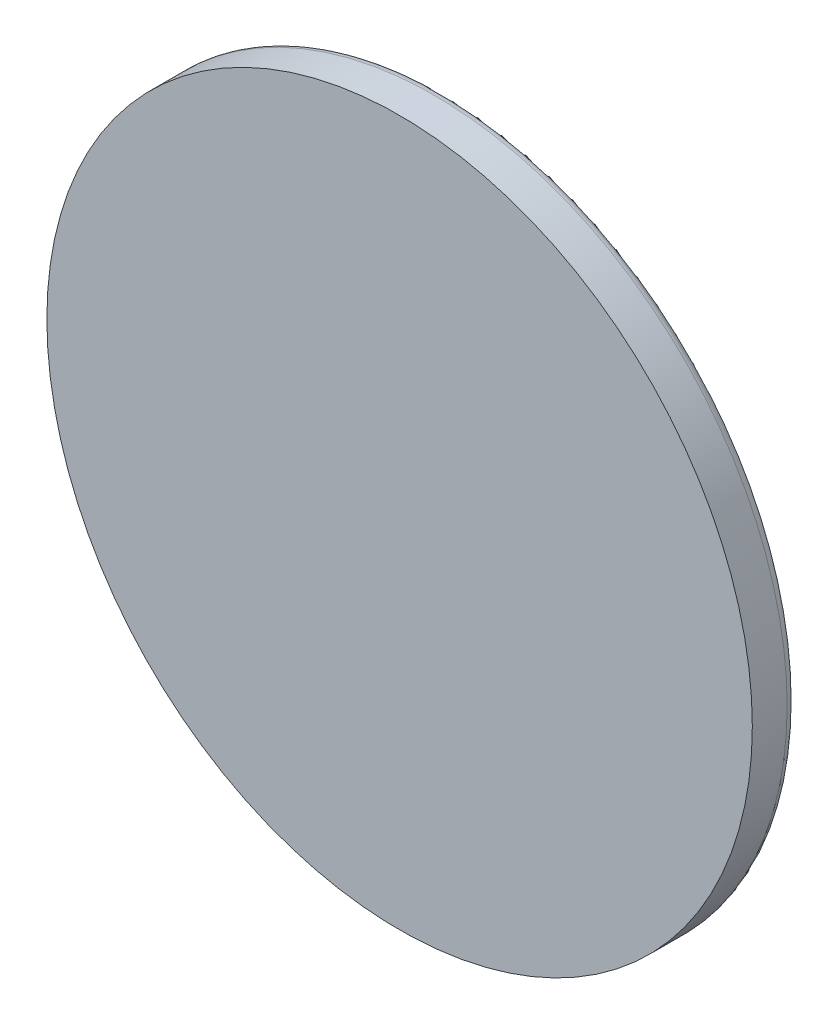
ISO-10303-21;
HEADER;
FILE_DESCRIPTION(('STEP AP214'),'2;1');
FILE_NAME('part.step','',(''),(''),'','','');
FILE_SCHEMA(('AUTOMOTIVE_DESIGN { 1 0 10303 214 1 1 1 1 }'));
ENDSEC;
DATA;
#1=APPLICATION_CONTEXT('core data for automotive mechanical design processes');
#2=APPLICATION_PROTOCOL_DEFINITION('international standard','automotive_design',2000,#1);
#3=PRODUCT_CONTEXT('',#1,'mechanical');
#4=PRODUCT('Part','Part','',(#3));
#5=PRODUCT_RELATED_PRODUCT_CATEGORY('part','',(#4));
#6=PRODUCT_DEFINITION_FORMATION('','',#4);
#7=PRODUCT_DEFINITION_CONTEXT('part definition',#1,'design');
#8=PRODUCT_DEFINITION('design','',#6,#7);
#9=PRODUCT_DEFINITION_SHAPE('','',#8);
#10=(LENGTH_UNIT() NAMED_UNIT(*) SI_UNIT(.MILLI.,.METRE.));
#11=(NAMED_UNIT(*) PLANE_ANGLE_UNIT() SI_UNIT($,.RADIAN.));
#12=(NAMED_UNIT(*) SI_UNIT($,.STERADIAN.) SOLID_ANGLE_UNIT());
#13=UNCERTAINTY_MEASURE_WITH_UNIT(LENGTH_MEASURE(1.E-05),#10,'distance_accuracy_value','');
#14=(GEOMETRIC_REPRESENTATION_CONTEXT(3) GLOBAL_UNCERTAINTY_ASSIGNED_CONTEXT((#13)) GLOBAL_UNIT_ASSIGNED_CONTEXT((#10,
#11,#12)) REPRESENTATION_CONTEXT('',''));
#15=CARTESIAN_POINT('',(0.,0.,0.));
#16=DIRECTION('',(0.,0.,1.));
#17=DIRECTION('',(1.,0.,0.));
#18=AXIS2_PLACEMENT_3D('',#15,#16,#17);
#19=CARTESIAN_POINT('',(-43.,22.86,-2.3495));
#20=DIRECTION('',(0.,0.,1.));
#21=DIRECTION('',(1.,0.,0.));
#22=AXIS2_PLACEMENT_3D('',#19,#20,#21);
#23=CYLINDRICAL_SURFACE('',#22,18.65);
#24=CARTESIAN_POINT('',(-43.,22.86,-1.8415));
#25=DIRECTION('',(0.,0.,1.));
#26=DIRECTION('',(1.,0.,0.));
#27=AXIS2_PLACEMENT_3D('',#24,#25,#26);
#28=CIRCLE('',#27,18.65);
#29=CARTESIAN_POINT('',(-24.35,22.86,-1.8415));
#30=VERTEX_POINT('',#29);
#31=EDGE_CURVE('E58',#30,#30,#28,.T.);
#32=ORIENTED_EDGE('',*,*,#31,.T.);
#33=EDGE_LOOP('',(#32));
#34=FACE_BOUND('',#33,.T.);
#35=CARTESIAN_POINT('',(-43.,22.86,0.));
#36=DIRECTION('',(0.,0.,1.));
#37=DIRECTION('',(1.,0.,0.));
#38=AXIS2_PLACEMENT_3D('',#35,#36,#37);
#39=CIRCLE('',#38,18.65);
#40=CARTESIAN_POINT('',(-24.35,22.86,0.));
#41=VERTEX_POINT('',#40);
#42=EDGE_CURVE('E61',#41,#41,#39,.T.);
#43=ORIENTED_EDGE('',*,*,#42,.F.);
#44=EDGE_LOOP('',(#43));
#45=FACE_BOUND('',#44,.T.);
#46=ADVANCED_FACE('F35',(#34,#45),#23,.T.);
#47=CARTESIAN_POINT('',(-43.,22.86,-2.3495));
#48=DIRECTION('',(0.,0.,1.));
#49=DIRECTION('',(1.,0.,0.));
#50=AXIS2_PLACEMENT_3D('',#47,#48,#49);
#51=PLANE('',#50);
#52=CARTESIAN_POINT('',(-43.,22.86,-2.3495));
#53=DIRECTION('',(0.,0.,1.));
#54=DIRECTION('',(1.,0.,0.));
#55=AXIS2_PLACEMENT_3D('',#52,#53,#54);
#56=CIRCLE('',#55,18.142);
#57=CARTESIAN_POINT('',(-24.858,22.86,-2.3495));
#58=VERTEX_POINT('',#57);
#59=EDGE_CURVE('E50',#58,#58,#56,.F.);
#60=ORIENTED_EDGE('',*,*,#59,.T.);
#61=EDGE_LOOP('',(#60));
#62=FACE_BOUND('',#61,.T.);
#63=CARTESIAN_POINT('',(-43.,22.86,-2.3495));
#64=DIRECTION('',(0.,0.,1.));
#65=DIRECTION('',(1.,0.,0.));
#66=AXIS2_PLACEMENT_3D('',#63,#64,#65);
#67=CIRCLE('',#66,12.954);
#68=CARTESIAN_POINT('',(-30.046,22.86,-2.3495));
#69=VERTEX_POINT('',#68);
#70=EDGE_CURVE('E55',#69,#69,#67,.T.);
#71=ORIENTED_EDGE('',*,*,#70,.T.);
#72=EDGE_LOOP('',(#71));
#73=FACE_BOUND('',#72,.T.);
#74=ADVANCED_FACE('F101',(#62,#73),#51,.F.);
#75=CARTESIAN_POINT('',(-43.,22.86,0.));
#76=DIRECTION('',(0.,0.,1.));
#77=DIRECTION('',(1.,0.,0.));
#78=AXIS2_PLACEMENT_3D('',#75,#76,#77);
#79=PLANE('',#78);
#80=ORIENTED_EDGE('',*,*,#42,.T.);
#81=EDGE_LOOP('',(#80));
#82=FACE_BOUND('',#81,.T.);
#83=ADVANCED_FACE('F107',(#82),#79,.T.);
#84=CARTESIAN_POINT('',(-43.,22.86,-41.5526039945911));
#85=DIRECTION('',(0.,0.,1.));
#86=DIRECTION('',(1.,0.,0.));
#87=AXIS2_PLACEMENT_3D('',#84,#85,#86);
#88=CYLINDRICAL_SURFACE('',#87,12.446);
#89=CARTESIAN_POINT('',(-43.,22.86,-2.8575));
#90=DIRECTION('',(0.,0.,1.));
#91=DIRECTION('',(1.,0.,0.));
#92=AXIS2_PLACEMENT_3D('',#89,#90,#91);
#93=CIRCLE('',#92,12.446);
#94=CARTESIAN_POINT('',(-30.554,22.86,-2.8575));
#95=VERTEX_POINT('',#94);
#96=EDGE_CURVE('E42',#95,#95,#93,.F.);
#97=ORIENTED_EDGE('',*,*,#96,.T.);
#98=EDGE_LOOP('',(#97));
#99=FACE_BOUND('',#98,.T.);
#100=CARTESIAN_POINT('',(-43.,22.86,-5.84200000000001));
#101=DIRECTION('',(0.,0.,-1.));
#102=DIRECTION('',(-1.,0.,0.));
#103=AXIS2_PLACEMENT_3D('',#100,#101,#102);
#104=CIRCLE('',#103,12.446);
#105=CARTESIAN_POINT('',(-55.446,22.86,-5.84200000000001));
#106=VERTEX_POINT('',#105);
#107=EDGE_CURVE('E46',#106,#106,#104,.F.);
#108=ORIENTED_EDGE('',*,*,#107,.T.);
#109=EDGE_LOOP('',(#108));
#110=FACE_BOUND('',#109,.T.);
#111=ADVANCED_FACE('F84',(#99,#110),#88,.T.);
#112=CARTESIAN_POINT('',(-13.1,121.028194109273,-6.35000000000001));
#113=DIRECTION('',(0.,0.,-1.));
#114=DIRECTION('',(0.,-1.,0.));
#115=AXIS2_PLACEMENT_3D('',#112,#113,#114);
#116=PLANE('',#115);
#117=CARTESIAN_POINT('',(-43.,22.86,-6.35000000000001));
#118=DIRECTION('',(0.,0.,-1.));
#119=DIRECTION('',(-1.,0.,0.));
#120=AXIS2_PLACEMENT_3D('',#117,#118,#119);
#121=CIRCLE('',#120,11.938);
#122=CARTESIAN_POINT('',(-54.938,22.86,-6.35000000000001));
#123=VERTEX_POINT('',#122);
#124=EDGE_CURVE('E11',#123,#123,#121,.T.);
#125=ORIENTED_EDGE('',*,*,#124,.T.);
#126=EDGE_LOOP('',(#125));
#127=FACE_BOUND('',#126,.T.);
#128=CARTESIAN_POINT('',(-43.,16.637,-6.35000000000001));
#129=DIRECTION('',(0.,0.,-1.));
#130=DIRECTION('',(1.,0.,0.));
#131=AXIS2_PLACEMENT_3D('',#128,#129,#130);
#132=CIRCLE('',#131,3.3275);
#133=CARTESIAN_POINT('',(-39.6725,16.637,-6.35000000000001));
#134=VERTEX_POINT('',#133);
#135=EDGE_CURVE('E73',#134,#134,#132,.T.);
#136=ORIENTED_EDGE('',*,*,#135,.F.);
#137=EDGE_LOOP('',(#136));
#138=FACE_BOUND('',#137,.T.);
#139=CARTESIAN_POINT('',(-43.,29.083,-6.35000000000001));
#140=DIRECTION('',(0.,0.,-1.));
#141=DIRECTION('',(-1.,0.,0.));
#142=AXIS2_PLACEMENT_3D('',#139,#140,#141);
#143=CIRCLE('',#142,3.3275);
#144=CARTESIAN_POINT('',(-46.3275,29.083,-6.35000000000001));
#145=VERTEX_POINT('',#144);
#146=EDGE_CURVE('E67',#145,#145,#143,.T.);
#147=ORIENTED_EDGE('',*,*,#146,.F.);
#148=EDGE_LOOP('',(#147));
#149=FACE_BOUND('',#148,.T.);
#150=ADVANCED_FACE('F80',(#127,#138,#149),#116,.T.);
#151=CARTESIAN_POINT('',(-43.,22.86,-0.5));
#152=DIRECTION('',(0.,0.,1.));
#153=DIRECTION('',(1.,0.,0.));
#154=AXIS2_PLACEMENT_3D('',#151,#152,#153);
#155=PLANE('',#154);
#156=CARTESIAN_POINT('',(-43.,29.083,-0.5));
#157=DIRECTION('',(0.,0.,1.));
#158=DIRECTION('',(1.,0.,0.));
#159=AXIS2_PLACEMENT_3D('',#156,#157,#158);
#160=CIRCLE('',#159,3.3275);
#161=CARTESIAN_POINT('',(-39.6725,29.083,-0.5));
#162=VERTEX_POINT('',#161);
#163=EDGE_CURVE('E64',#162,#162,#160,.F.);
#164=ORIENTED_EDGE('',*,*,#163,.T.);
#165=EDGE_LOOP('',(#164));
#166=FACE_BOUND('',#165,.T.);
#167=ADVANCED_FACE('F83',(#166),#155,.F.);
#168=CARTESIAN_POINT('',(-43.,29.083,9.41159125759294));
#169=DIRECTION('',(0.,0.,-1.));
#170=DIRECTION('',(-1.,0.,0.));
#171=AXIS2_PLACEMENT_3D('',#168,#169,#170);
#172=CYLINDRICAL_SURFACE('',#171,3.3275);
#173=ORIENTED_EDGE('',*,*,#146,.T.);
#174=EDGE_LOOP('',(#173));
#175=FACE_BOUND('',#174,.T.);
#176=ORIENTED_EDGE('',*,*,#163,.F.);
#177=EDGE_LOOP('',(#176));
#178=FACE_BOUND('',#177,.T.);
#179=ADVANCED_FACE('F88',(#175,#178),#172,.F.);
#180=CARTESIAN_POINT('',(-43.,22.86,-0.5));
#181=DIRECTION('',(0.,0.,1.));
#182=DIRECTION('',(1.,0.,0.));
#183=AXIS2_PLACEMENT_3D('',#180,#181,#182);
#184=PLANE('',#183);
#185=CARTESIAN_POINT('',(-43.,16.637,-0.5));
#186=DIRECTION('',(0.,0.,1.));
#187=DIRECTION('',(1.,0.,0.));
#188=AXIS2_PLACEMENT_3D('',#185,#186,#187);
#189=CIRCLE('',#188,3.3275);
#190=CARTESIAN_POINT('',(-39.6725,16.637,-0.5));
#191=VERTEX_POINT('',#190);
#192=EDGE_CURVE('E70',#191,#191,#189,.F.);
#193=ORIENTED_EDGE('',*,*,#192,.T.);
#194=EDGE_LOOP('',(#193));
#195=FACE_BOUND('',#194,.T.);
#196=ADVANCED_FACE('F91',(#195),#184,.F.);
#197=CARTESIAN_POINT('',(-43.,16.637,9.41159125759294));
#198=DIRECTION('',(0.,0.,-1.));
#199=DIRECTION('',(-1.,0.,0.));
#200=AXIS2_PLACEMENT_3D('',#197,#198,#199);
#201=CYLINDRICAL_SURFACE('',#200,3.3275);
#202=ORIENTED_EDGE('',*,*,#135,.T.);
#203=EDGE_LOOP('',(#202));
#204=FACE_BOUND('',#203,.T.);
#205=ORIENTED_EDGE('',*,*,#192,.F.);
#206=EDGE_LOOP('',(#205));
#207=FACE_BOUND('',#206,.T.);
#208=ADVANCED_FACE('F77',(#204,#207),#201,.F.);
#209=CARTESIAN_POINT('',(-43.,22.86,-1.8415));
#210=DIRECTION('',(0.,0.,1.));
#211=DIRECTION('',(1.,0.,0.));
#212=AXIS2_PLACEMENT_3D('',#209,#210,#211);
#213=TOROIDAL_SURFACE('',#212,18.142,0.508);
#214=ORIENTED_EDGE('',*,*,#59,.F.);
#215=EDGE_LOOP('',(#214));
#216=FACE_BOUND('',#215,.T.);
#217=ORIENTED_EDGE('',*,*,#31,.F.);
#218=EDGE_LOOP('',(#217));
#219=FACE_BOUND('',#218,.T.);
#220=ADVANCED_FACE('F113',(#216,#219),#213,.T.);
#221=CARTESIAN_POINT('',(-43.,22.86,-2.8575));
#222=DIRECTION('',(0.,0.,1.));
#223=DIRECTION('',(1.,0.,0.));
#224=AXIS2_PLACEMENT_3D('',#221,#222,#223);
#225=TOROIDAL_SURFACE('',#224,12.954,0.508);
#226=ORIENTED_EDGE('',*,*,#70,.F.);
#227=EDGE_LOOP('',(#226));
#228=FACE_BOUND('',#227,.T.);
#229=ORIENTED_EDGE('',*,*,#96,.F.);
#230=EDGE_LOOP('',(#229));
#231=FACE_BOUND('',#230,.T.);
#232=ADVANCED_FACE('F115',(#228,#231),#225,.F.);
#233=CARTESIAN_POINT('',(-43.,22.86,-5.84200000000001));
#234=DIRECTION('',(0.,0.,-1.));
#235=DIRECTION('',(-1.,0.,0.));
#236=AXIS2_PLACEMENT_3D('',#233,#234,#235);
#237=TOROIDAL_SURFACE('',#236,11.938,0.508);
#238=ORIENTED_EDGE('',*,*,#107,.F.);
#239=EDGE_LOOP('',(#238));
#240=FACE_BOUND('',#239,.T.);
#241=ORIENTED_EDGE('',*,*,#124,.F.);
#242=EDGE_LOOP('',(#241));
#243=FACE_BOUND('',#242,.T.);
#244=ADVANCED_FACE('F37',(#240,#243),#237,.T.);
#245=CLOSED_SHELL('',(#46,#74,#83,#111,#150,#167,#179,#196,#208,#220,#232,#244));
#246=MANIFOLD_SOLID_BREP('B2',#245);
#247=ADVANCED_BREP_SHAPE_REPRESENTATION('',(#18,#246),#14);
#248=SHAPE_DEFINITION_REPRESENTATION(#9,#247);
ENDSEC;
END-ISO-10303-21;
